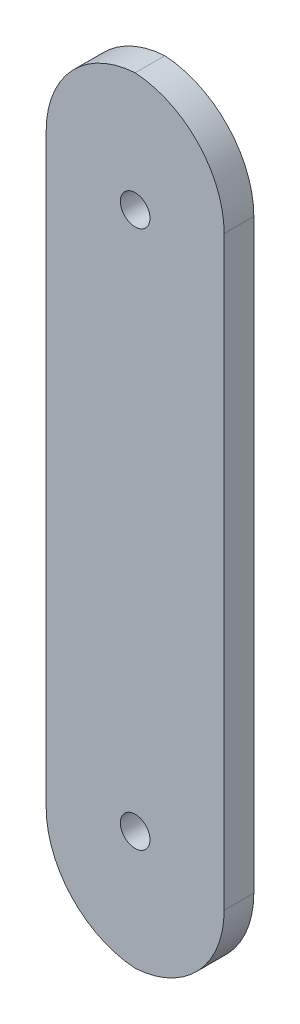
ISO-10303-21;
HEADER;
FILE_DESCRIPTION(('STEP AP214'),'2;1');
FILE_NAME('part.step','',(''),(''),'','','');
FILE_SCHEMA(('AUTOMOTIVE_DESIGN { 1 0 10303 214 1 1 1 1 }'));
ENDSEC;
DATA;
#1=APPLICATION_CONTEXT('core data for automotive mechanical design processes');
#2=APPLICATION_PROTOCOL_DEFINITION('international standard','automotive_design',2000,#1);
#3=PRODUCT_CONTEXT('',#1,'mechanical');
#4=PRODUCT('Part','Part','',(#3));
#5=PRODUCT_RELATED_PRODUCT_CATEGORY('part','',(#4));
#6=PRODUCT_DEFINITION_FORMATION('','',#4);
#7=PRODUCT_DEFINITION_CONTEXT('part definition',#1,'design');
#8=PRODUCT_DEFINITION('design','',#6,#7);
#9=PRODUCT_DEFINITION_SHAPE('','',#8);
#10=(LENGTH_UNIT() NAMED_UNIT(*) SI_UNIT(.MILLI.,.METRE.));
#11=(NAMED_UNIT(*) PLANE_ANGLE_UNIT() SI_UNIT($,.RADIAN.));
#12=(NAMED_UNIT(*) SI_UNIT($,.STERADIAN.) SOLID_ANGLE_UNIT());
#13=UNCERTAINTY_MEASURE_WITH_UNIT(LENGTH_MEASURE(1.E-05),#10,'distance_accuracy_value','');
#14=(GEOMETRIC_REPRESENTATION_CONTEXT(3) GLOBAL_UNCERTAINTY_ASSIGNED_CONTEXT((#13)) GLOBAL_UNIT_ASSIGNED_CONTEXT((#10,
#11,#12)) REPRESENTATION_CONTEXT('',''));
#15=CARTESIAN_POINT('',(0.,0.,0.));
#16=DIRECTION('',(0.,0.,1.));
#17=DIRECTION('',(1.,0.,0.));
#18=AXIS2_PLACEMENT_3D('',#15,#16,#17);
#19=CARTESIAN_POINT('',(0.,0.,3.175));
#20=DIRECTION('',(-1.,0.,0.));
#21=DIRECTION('',(0.,0.,1.));
#22=AXIS2_PLACEMENT_3D('',#19,#20,#21);
#23=PLANE('',#22);
#24=DIRECTION('',(0.,1.,0.));
#25=VECTOR('',#24,1.);
#26=CARTESIAN_POINT('',(0.,0.,3.175));
#27=LINE('',#26,#25);
#28=CARTESIAN_POINT('',(0.,10.16,3.175));
#29=VERTEX_POINT('',#28);
#30=CARTESIAN_POINT('',(0.,72.898,3.175));
#31=VERTEX_POINT('',#30);
#32=EDGE_CURVE('E90',#29,#31,#27,.T.);
#33=ORIENTED_EDGE('',*,*,#32,.F.);
#34=DIRECTION('',(0.,0.,-1.));
#35=VECTOR('',#34,1.);
#36=CARTESIAN_POINT('',(0.,10.16,3.175));
#37=LINE('',#36,#35);
#38=CARTESIAN_POINT('',(0.,10.16,0.));
#39=VERTEX_POINT('',#38);
#40=EDGE_CURVE('E11',#29,#39,#37,.T.);
#41=ORIENTED_EDGE('',*,*,#40,.T.);
#42=DIRECTION('',(0.,1.,0.));
#43=VECTOR('',#42,1.);
#44=CARTESIAN_POINT('',(0.,0.,0.));
#45=LINE('',#44,#43);
#46=CARTESIAN_POINT('',(0.,72.898,0.));
#47=VERTEX_POINT('',#46);
#48=EDGE_CURVE('E88',#39,#47,#45,.T.);
#49=ORIENTED_EDGE('',*,*,#48,.T.);
#50=DIRECTION('',(0.,0.,-1.));
#51=VECTOR('',#50,1.);
#52=CARTESIAN_POINT('',(0.,72.898,3.175));
#53=LINE('',#52,#51);
#54=EDGE_CURVE('E41',#47,#31,#53,.F.);
#55=ORIENTED_EDGE('',*,*,#54,.T.);
#56=EDGE_LOOP('',(#33,#41,#49,#55));
#57=FACE_BOUND('',#56,.T.);
#58=ADVANCED_FACE('F32',(#57),#23,.F.);
#59=CARTESIAN_POINT('',(-19.05,0.,3.175));
#60=DIRECTION('',(1.,0.,0.));
#61=DIRECTION('',(0.,0.,-1.));
#62=AXIS2_PLACEMENT_3D('',#59,#60,#61);
#63=PLANE('',#62);
#64=DIRECTION('',(0.,-1.,0.));
#65=VECTOR('',#64,1.);
#66=CARTESIAN_POINT('',(-19.05,0.,0.));
#67=LINE('',#66,#65);
#68=CARTESIAN_POINT('',(-19.05,72.898,0.));
#69=VERTEX_POINT('',#68);
#70=CARTESIAN_POINT('',(-19.05,10.16,0.));
#71=VERTEX_POINT('',#70);
#72=EDGE_CURVE('E99',#69,#71,#67,.T.);
#73=ORIENTED_EDGE('',*,*,#72,.T.);
#74=DIRECTION('',(0.,0.,-1.));
#75=VECTOR('',#74,1.);
#76=CARTESIAN_POINT('',(-19.05,10.16,3.175));
#77=LINE('',#76,#75);
#78=CARTESIAN_POINT('',(-19.05,10.16,3.175));
#79=VERTEX_POINT('',#78);
#80=EDGE_CURVE('E115',#71,#79,#77,.F.);
#81=ORIENTED_EDGE('',*,*,#80,.T.);
#82=DIRECTION('',(0.,-1.,0.));
#83=VECTOR('',#82,1.);
#84=CARTESIAN_POINT('',(-19.05,0.,3.175));
#85=LINE('',#84,#83);
#86=CARTESIAN_POINT('',(-19.05,72.898,3.175));
#87=VERTEX_POINT('',#86);
#88=EDGE_CURVE('E144',#87,#79,#85,.T.);
#89=ORIENTED_EDGE('',*,*,#88,.F.);
#90=DIRECTION('',(0.,0.,-1.));
#91=VECTOR('',#90,1.);
#92=CARTESIAN_POINT('',(-19.05,72.898,3.175));
#93=LINE('',#92,#91);
#94=EDGE_CURVE('E108',#87,#69,#93,.T.);
#95=ORIENTED_EDGE('',*,*,#94,.T.);
#96=EDGE_LOOP('',(#73,#81,#89,#95));
#97=FACE_BOUND('',#96,.T.);
#98=ADVANCED_FACE('F150',(#97),#63,.F.);
#99=CARTESIAN_POINT('',(0.,0.,3.175));
#100=DIRECTION('',(0.,0.,1.));
#101=DIRECTION('',(1.,0.,0.));
#102=AXIS2_PLACEMENT_3D('',#99,#100,#101);
#103=PLANE('',#102);
#104=CARTESIAN_POINT('',(-9.525,12.7198631666037,3.175));
#105=DIRECTION('',(0.,0.,1.));
#106=DIRECTION('',(1.,0.,0.));
#107=AXIS2_PLACEMENT_3D('',#104,#105,#106);
#108=CIRCLE('',#107,1.5875);
#109=CARTESIAN_POINT('',(-7.9375,12.7198631666037,3.175));
#110=VERTEX_POINT('',#109);
#111=EDGE_CURVE('E130',#110,#110,#108,.T.);
#112=ORIENTED_EDGE('',*,*,#111,.F.);
#113=EDGE_LOOP('',(#112));
#114=FACE_BOUND('',#113,.T.);
#115=CARTESIAN_POINT('',(-9.525,70.3381368333963,3.175));
#116=DIRECTION('',(0.,0.,1.));
#117=DIRECTION('',(1.,0.,0.));
#118=AXIS2_PLACEMENT_3D('',#115,#116,#117);
#119=CIRCLE('',#118,1.5875);
#120=CARTESIAN_POINT('',(-7.9375,70.3381368333963,3.175));
#121=VERTEX_POINT('',#120);
#122=EDGE_CURVE('E140',#121,#121,#119,.T.);
#123=ORIENTED_EDGE('',*,*,#122,.F.);
#124=EDGE_LOOP('',(#123));
#125=FACE_BOUND('',#124,.T.);
#126=ORIENTED_EDGE('',*,*,#88,.T.);
#127=CARTESIAN_POINT('',(-8.89,10.16,3.175));
#128=DIRECTION('',(0.,0.,1.));
#129=DIRECTION('',(1.,0.,0.));
#130=AXIS2_PLACEMENT_3D('',#127,#128,#129);
#131=CIRCLE('',#130,10.16);
#132=CARTESIAN_POINT('',(-9.525,0.0198631666037136,3.175));
#133=VERTEX_POINT('',#132);
#134=EDGE_CURVE('E49',#79,#133,#131,.T.);
#135=ORIENTED_EDGE('',*,*,#134,.T.);
#136=CARTESIAN_POINT('',(-10.16,10.16,3.175));
#137=DIRECTION('',(0.,0.,1.));
#138=DIRECTION('',(1.,0.,0.));
#139=AXIS2_PLACEMENT_3D('',#136,#137,#138);
#140=CIRCLE('',#139,10.16);
#141=EDGE_CURVE('E121',#133,#29,#140,.T.);
#142=ORIENTED_EDGE('',*,*,#141,.T.);
#143=ORIENTED_EDGE('',*,*,#32,.T.);
#144=CARTESIAN_POINT('',(-10.16,72.898,3.175));
#145=DIRECTION('',(0.,0.,1.));
#146=DIRECTION('',(1.,0.,0.));
#147=AXIS2_PLACEMENT_3D('',#144,#145,#146);
#148=CIRCLE('',#147,10.16);
#149=CARTESIAN_POINT('',(-9.525,83.0381368333963,3.175));
#150=VERTEX_POINT('',#149);
#151=EDGE_CURVE('E56',#31,#150,#148,.T.);
#152=ORIENTED_EDGE('',*,*,#151,.T.);
#153=CARTESIAN_POINT('',(-8.89,72.898,3.175));
#154=DIRECTION('',(0.,0.,1.));
#155=DIRECTION('',(1.,0.,0.));
#156=AXIS2_PLACEMENT_3D('',#153,#154,#155);
#157=CIRCLE('',#156,10.16);
#158=EDGE_CURVE('E119',#150,#87,#157,.T.);
#159=ORIENTED_EDGE('',*,*,#158,.T.);
#160=EDGE_LOOP('',(#126,#135,#142,#143,#152,#159));
#161=FACE_BOUND('',#160,.T.);
#162=ADVANCED_FACE('F168',(#114,#125,#161),#103,.T.);
#163=CARTESIAN_POINT('',(0.,0.,0.));
#164=DIRECTION('',(0.,0.,1.));
#165=DIRECTION('',(1.,0.,0.));
#166=AXIS2_PLACEMENT_3D('',#163,#164,#165);
#167=PLANE('',#166);
#168=CARTESIAN_POINT('',(-9.525,12.7198631666037,0.));
#169=DIRECTION('',(0.,0.,1.));
#170=DIRECTION('',(1.,0.,0.));
#171=AXIS2_PLACEMENT_3D('',#168,#169,#170);
#172=CIRCLE('',#171,1.5875);
#173=CARTESIAN_POINT('',(-7.9375,12.7198631666037,0.));
#174=VERTEX_POINT('',#173);
#175=EDGE_CURVE('E126',#174,#174,#172,.T.);
#176=ORIENTED_EDGE('',*,*,#175,.T.);
#177=EDGE_LOOP('',(#176));
#178=FACE_BOUND('',#177,.T.);
#179=CARTESIAN_POINT('',(-9.525,70.3381368333963,0.));
#180=DIRECTION('',(0.,0.,1.));
#181=DIRECTION('',(1.,0.,0.));
#182=AXIS2_PLACEMENT_3D('',#179,#180,#181);
#183=CIRCLE('',#182,1.5875);
#184=CARTESIAN_POINT('',(-7.9375,70.3381368333963,0.));
#185=VERTEX_POINT('',#184);
#186=EDGE_CURVE('E135',#185,#185,#183,.T.);
#187=ORIENTED_EDGE('',*,*,#186,.T.);
#188=EDGE_LOOP('',(#187));
#189=FACE_BOUND('',#188,.T.);
#190=CARTESIAN_POINT('',(-10.16,10.16,0.));
#191=DIRECTION('',(0.,0.,1.));
#192=DIRECTION('',(1.,0.,0.));
#193=AXIS2_PLACEMENT_3D('',#190,#191,#192);
#194=CIRCLE('',#193,10.16);
#195=CARTESIAN_POINT('',(-9.525,0.0198631666037136,0.));
#196=VERTEX_POINT('',#195);
#197=EDGE_CURVE('E95',#39,#196,#194,.F.);
#198=ORIENTED_EDGE('',*,*,#197,.T.);
#199=CARTESIAN_POINT('',(-8.89,10.16,0.));
#200=DIRECTION('',(0.,0.,1.));
#201=DIRECTION('',(1.,0.,0.));
#202=AXIS2_PLACEMENT_3D('',#199,#200,#201);
#203=CIRCLE('',#202,10.16);
#204=EDGE_CURVE('E105',#196,#71,#203,.F.);
#205=ORIENTED_EDGE('',*,*,#204,.T.);
#206=ORIENTED_EDGE('',*,*,#72,.F.);
#207=CARTESIAN_POINT('',(-8.89,72.898,0.));
#208=DIRECTION('',(0.,0.,1.));
#209=DIRECTION('',(1.,0.,0.));
#210=AXIS2_PLACEMENT_3D('',#207,#208,#209);
#211=CIRCLE('',#210,10.16);
#212=CARTESIAN_POINT('',(-9.525,83.0381368333963,0.));
#213=VERTEX_POINT('',#212);
#214=EDGE_CURVE('E106',#69,#213,#211,.F.);
#215=ORIENTED_EDGE('',*,*,#214,.T.);
#216=CARTESIAN_POINT('',(-10.16,72.898,0.));
#217=DIRECTION('',(0.,0.,1.));
#218=DIRECTION('',(1.,0.,0.));
#219=AXIS2_PLACEMENT_3D('',#216,#217,#218);
#220=CIRCLE('',#219,10.16);
#221=EDGE_CURVE('E98',#213,#47,#220,.F.);
#222=ORIENTED_EDGE('',*,*,#221,.T.);
#223=ORIENTED_EDGE('',*,*,#48,.F.);
#224=EDGE_LOOP('',(#198,#205,#206,#215,#222,#223));
#225=FACE_BOUND('',#224,.T.);
#226=ADVANCED_FACE('F94',(#178,#189,#225),#167,.F.);
#227=CARTESIAN_POINT('',(-10.16,10.16,3.175));
#228=DIRECTION('',(0.,0.,-1.));
#229=DIRECTION('',(-1.,0.,0.));
#230=AXIS2_PLACEMENT_3D('',#227,#228,#229);
#231=CYLINDRICAL_SURFACE('',#230,10.16);
#232=ORIENTED_EDGE('',*,*,#40,.F.);
#233=ORIENTED_EDGE('',*,*,#141,.F.);
#234=DIRECTION('',(0.,0.,-1.));
#235=VECTOR('',#234,1.);
#236=CARTESIAN_POINT('',(-9.525,0.0198631666037154,1.5875));
#237=LINE('',#236,#235);
#238=EDGE_CURVE('E100',#196,#133,#237,.F.);
#239=ORIENTED_EDGE('',*,*,#238,.F.);
#240=ORIENTED_EDGE('',*,*,#197,.F.);
#241=EDGE_LOOP('',(#232,#233,#239,#240));
#242=FACE_BOUND('',#241,.T.);
#243=ADVANCED_FACE('F102',(#242),#231,.T.);
#244=CARTESIAN_POINT('',(-8.89,10.16,3.175));
#245=DIRECTION('',(0.,0.,-1.));
#246=DIRECTION('',(-1.,0.,0.));
#247=AXIS2_PLACEMENT_3D('',#244,#245,#246);
#248=CYLINDRICAL_SURFACE('',#247,10.16);
#249=ORIENTED_EDGE('',*,*,#134,.F.);
#250=ORIENTED_EDGE('',*,*,#80,.F.);
#251=ORIENTED_EDGE('',*,*,#204,.F.);
#252=ORIENTED_EDGE('',*,*,#238,.T.);
#253=EDGE_LOOP('',(#249,#250,#251,#252));
#254=FACE_BOUND('',#253,.T.);
#255=ADVANCED_FACE('F153',(#254),#248,.T.);
#256=CARTESIAN_POINT('',(-10.16,72.898,3.175));
#257=DIRECTION('',(0.,0.,-1.));
#258=DIRECTION('',(-1.,0.,0.));
#259=AXIS2_PLACEMENT_3D('',#256,#257,#258);
#260=CYLINDRICAL_SURFACE('',#259,10.16);
#261=DIRECTION('',(0.,0.,-1.));
#262=VECTOR('',#261,1.);
#263=CARTESIAN_POINT('',(-9.525,83.0381368333963,1.5875));
#264=LINE('',#263,#262);
#265=EDGE_CURVE('E36',#150,#213,#264,.T.);
#266=ORIENTED_EDGE('',*,*,#265,.F.);
#267=ORIENTED_EDGE('',*,*,#151,.F.);
#268=ORIENTED_EDGE('',*,*,#54,.F.);
#269=ORIENTED_EDGE('',*,*,#221,.F.);
#270=EDGE_LOOP('',(#266,#267,#268,#269));
#271=FACE_BOUND('',#270,.T.);
#272=ADVANCED_FACE('F34',(#271),#260,.T.);
#273=CARTESIAN_POINT('',(-8.89,72.898,3.175));
#274=DIRECTION('',(0.,0.,-1.));
#275=DIRECTION('',(-1.,0.,0.));
#276=AXIS2_PLACEMENT_3D('',#273,#274,#275);
#277=CYLINDRICAL_SURFACE('',#276,10.16);
#278=ORIENTED_EDGE('',*,*,#158,.F.);
#279=ORIENTED_EDGE('',*,*,#265,.T.);
#280=ORIENTED_EDGE('',*,*,#214,.F.);
#281=ORIENTED_EDGE('',*,*,#94,.F.);
#282=EDGE_LOOP('',(#278,#279,#280,#281));
#283=FACE_BOUND('',#282,.T.);
#284=ADVANCED_FACE('F160',(#283),#277,.T.);
#285=CARTESIAN_POINT('',(-9.525,70.3381368333963,0.));
#286=DIRECTION('',(0.,0.,1.));
#287=DIRECTION('',(1.,0.,0.));
#288=AXIS2_PLACEMENT_3D('',#285,#286,#287);
#289=CYLINDRICAL_SURFACE('',#288,1.5875);
#290=ORIENTED_EDGE('',*,*,#186,.F.);
#291=EDGE_LOOP('',(#290));
#292=FACE_BOUND('',#291,.T.);
#293=ORIENTED_EDGE('',*,*,#122,.T.);
#294=EDGE_LOOP('',(#293));
#295=FACE_BOUND('',#294,.T.);
#296=ADVANCED_FACE('F176',(#292,#295),#289,.F.);
#297=CARTESIAN_POINT('',(-9.525,12.7198631666037,0.));
#298=DIRECTION('',(0.,0.,1.));
#299=DIRECTION('',(1.,0.,0.));
#300=AXIS2_PLACEMENT_3D('',#297,#298,#299);
#301=CYLINDRICAL_SURFACE('',#300,1.5875);
#302=ORIENTED_EDGE('',*,*,#175,.F.);
#303=EDGE_LOOP('',(#302));
#304=FACE_BOUND('',#303,.T.);
#305=ORIENTED_EDGE('',*,*,#111,.T.);
#306=EDGE_LOOP('',(#305));
#307=FACE_BOUND('',#306,.T.);
#308=ADVANCED_FACE('F179',(#304,#307),#301,.F.);
#309=CLOSED_SHELL('',(#58,#98,#162,#226,#243,#255,#272,#284,#296,#308));
#310=MANIFOLD_SOLID_BREP('B2',#309);
#311=ADVANCED_BREP_SHAPE_REPRESENTATION('',(#18,#310),#14);
#312=SHAPE_DEFINITION_REPRESENTATION(#9,#311);
ENDSEC;
END-ISO-10303-21;
